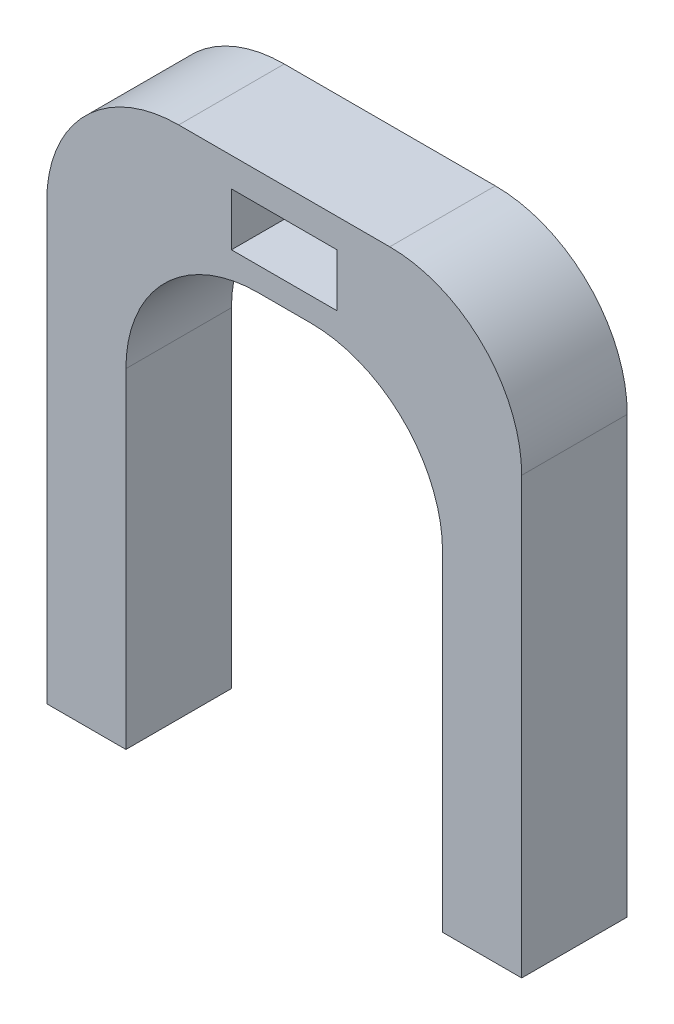
ISO-10303-21;
HEADER;
FILE_DESCRIPTION(('STEP AP214'),'2;1');
FILE_NAME('part.step','',(''),(''),'','','');
FILE_SCHEMA(('AUTOMOTIVE_DESIGN { 1 0 10303 214 1 1 1 1 }'));
ENDSEC;
DATA;
#1=APPLICATION_CONTEXT('core data for automotive mechanical design processes');
#2=APPLICATION_PROTOCOL_DEFINITION('international standard','automotive_design',2000,#1);
#3=PRODUCT_CONTEXT('',#1,'mechanical');
#4=PRODUCT('Part','Part','',(#3));
#5=PRODUCT_RELATED_PRODUCT_CATEGORY('part','',(#4));
#6=PRODUCT_DEFINITION_FORMATION('','',#4);
#7=PRODUCT_DEFINITION_CONTEXT('part definition',#1,'design');
#8=PRODUCT_DEFINITION('design','',#6,#7);
#9=PRODUCT_DEFINITION_SHAPE('','',#8);
#10=(LENGTH_UNIT() NAMED_UNIT(*) SI_UNIT(.MILLI.,.METRE.));
#11=(NAMED_UNIT(*) PLANE_ANGLE_UNIT() SI_UNIT($,.RADIAN.));
#12=(NAMED_UNIT(*) SI_UNIT($,.STERADIAN.) SOLID_ANGLE_UNIT());
#13=UNCERTAINTY_MEASURE_WITH_UNIT(LENGTH_MEASURE(1.E-05),#10,'distance_accuracy_value','');
#14=(GEOMETRIC_REPRESENTATION_CONTEXT(3) GLOBAL_UNCERTAINTY_ASSIGNED_CONTEXT((#13)) GLOBAL_UNIT_ASSIGNED_CONTEXT((#10,
#11,#12)) REPRESENTATION_CONTEXT('',''));
#15=CARTESIAN_POINT('',(0.,0.,0.));
#16=DIRECTION('',(0.,0.,1.));
#17=DIRECTION('',(1.,0.,0.));
#18=AXIS2_PLACEMENT_3D('',#15,#16,#17);
#19=CARTESIAN_POINT('',(0.,0.,4.));
#20=DIRECTION('',(0.,1.,0.));
#21=DIRECTION('',(0.,0.,1.));
#22=AXIS2_PLACEMENT_3D('',#19,#20,#21);
#23=PLANE('',#22);
#24=DIRECTION('',(1.,0.,0.));
#25=VECTOR('',#24,1.);
#26=CARTESIAN_POINT('',(0.,0.,0.));
#27=LINE('',#26,#25);
#28=CARTESIAN_POINT('',(0.,0.,0.));
#29=VERTEX_POINT('',#28);
#30=CARTESIAN_POINT('',(3.,0.,0.));
#31=VERTEX_POINT('',#30);
#32=EDGE_CURVE('E220',#29,#31,#27,.T.);
#33=ORIENTED_EDGE('',*,*,#32,.T.);
#34=DIRECTION('',(0.,0.,1.));
#35=VECTOR('',#34,1.);
#36=CARTESIAN_POINT('',(3.,0.,0.));
#37=LINE('',#36,#35);
#38=CARTESIAN_POINT('',(3.,0.,4.));
#39=VERTEX_POINT('',#38);
#40=EDGE_CURVE('E192',#31,#39,#37,.T.);
#41=ORIENTED_EDGE('',*,*,#40,.T.);
#42=DIRECTION('',(1.,0.,0.));
#43=VECTOR('',#42,1.);
#44=CARTESIAN_POINT('',(0.,0.,4.));
#45=LINE('',#44,#43);
#46=CARTESIAN_POINT('',(0.,0.,4.));
#47=VERTEX_POINT('',#46);
#48=EDGE_CURVE('E208',#47,#39,#45,.T.);
#49=ORIENTED_EDGE('',*,*,#48,.F.);
#50=DIRECTION('',(0.,0.,-1.));
#51=VECTOR('',#50,1.);
#52=CARTESIAN_POINT('',(0.,0.,4.));
#53=LINE('',#52,#51);
#54=EDGE_CURVE('E230',#47,#29,#53,.T.);
#55=ORIENTED_EDGE('',*,*,#54,.T.);
#56=EDGE_LOOP('',(#33,#41,#49,#55));
#57=FACE_BOUND('',#56,.T.);
#58=ADVANCED_FACE('F33',(#57),#23,.F.);
#59=CARTESIAN_POINT('',(0.,0.,4.));
#60=DIRECTION('',(1.,0.,0.));
#61=DIRECTION('',(0.,0.,-1.));
#62=AXIS2_PLACEMENT_3D('',#59,#60,#61);
#63=PLANE('',#62);
#64=DIRECTION('',(0.,-1.,0.));
#65=VECTOR('',#64,1.);
#66=CARTESIAN_POINT('',(0.,0.,4.));
#67=LINE('',#66,#65);
#68=CARTESIAN_POINT('',(0.,16.5,4.));
#69=VERTEX_POINT('',#68);
#70=EDGE_CURVE('E204',#69,#47,#67,.T.);
#71=ORIENTED_EDGE('',*,*,#70,.F.);
#72=DIRECTION('',(0.,0.,-1.));
#73=VECTOR('',#72,1.);
#74=CARTESIAN_POINT('',(0.,16.5,4.));
#75=LINE('',#74,#73);
#76=CARTESIAN_POINT('',(0.,16.5,0.));
#77=VERTEX_POINT('',#76);
#78=EDGE_CURVE('E11',#69,#77,#75,.T.);
#79=ORIENTED_EDGE('',*,*,#78,.T.);
#80=DIRECTION('',(0.,-1.,0.));
#81=VECTOR('',#80,1.);
#82=CARTESIAN_POINT('',(0.,0.,0.));
#83=LINE('',#82,#81);
#84=EDGE_CURVE('E201',#77,#29,#83,.T.);
#85=ORIENTED_EDGE('',*,*,#84,.T.);
#86=ORIENTED_EDGE('',*,*,#54,.F.);
#87=EDGE_LOOP('',(#71,#79,#85,#86));
#88=FACE_BOUND('',#87,.T.);
#89=ADVANCED_FACE('F314',(#88),#63,.F.);
#90=CARTESIAN_POINT('',(15.,0.,4.));
#91=VERTEX_POINT('',#90);
#92=CARTESIAN_POINT('',(18.,0.,4.));
#93=VERTEX_POINT('',#92);
#94=EDGE_CURVE('E206',#91,#93,#45,.T.);
#95=ORIENTED_EDGE('',*,*,#94,.F.);
#96=DIRECTION('',(0.,0.,1.));
#97=VECTOR('',#96,1.);
#98=CARTESIAN_POINT('',(15.,0.,0.));
#99=LINE('',#98,#97);
#100=CARTESIAN_POINT('',(15.,0.,0.));
#101=VERTEX_POINT('',#100);
#102=EDGE_CURVE('E199',#101,#91,#99,.T.);
#103=ORIENTED_EDGE('',*,*,#102,.F.);
#104=CARTESIAN_POINT('',(18.,0.,0.));
#105=VERTEX_POINT('',#104);
#106=EDGE_CURVE('E219',#101,#105,#27,.T.);
#107=ORIENTED_EDGE('',*,*,#106,.T.);
#108=DIRECTION('',(0.,0.,-1.));
#109=VECTOR('',#108,1.);
#110=CARTESIAN_POINT('',(18.,0.,4.));
#111=LINE('',#110,#109);
#112=EDGE_CURVE('E217',#93,#105,#111,.T.);
#113=ORIENTED_EDGE('',*,*,#112,.F.);
#114=EDGE_LOOP('',(#95,#103,#107,#113));
#115=FACE_BOUND('',#114,.T.);
#116=ADVANCED_FACE('F284',(#115),#23,.F.);
#117=CARTESIAN_POINT('',(18.,0.,4.));
#118=DIRECTION('',(-1.,0.,0.));
#119=DIRECTION('',(0.,0.,1.));
#120=AXIS2_PLACEMENT_3D('',#117,#118,#119);
#121=PLANE('',#120);
#122=DIRECTION('',(0.,1.,0.));
#123=VECTOR('',#122,1.);
#124=CARTESIAN_POINT('',(18.,0.,0.));
#125=LINE('',#124,#123);
#126=CARTESIAN_POINT('',(18.,16.5,0.));
#127=VERTEX_POINT('',#126);
#128=EDGE_CURVE('E223',#105,#127,#125,.T.);
#129=ORIENTED_EDGE('',*,*,#128,.T.);
#130=DIRECTION('',(0.,0.,-1.));
#131=VECTOR('',#130,1.);
#132=CARTESIAN_POINT('',(18.,16.5,4.));
#133=LINE('',#132,#131);
#134=CARTESIAN_POINT('',(18.,16.5,4.));
#135=VERTEX_POINT('',#134);
#136=EDGE_CURVE('E260',#127,#135,#133,.F.);
#137=ORIENTED_EDGE('',*,*,#136,.T.);
#138=DIRECTION('',(0.,1.,0.));
#139=VECTOR('',#138,1.);
#140=CARTESIAN_POINT('',(18.,0.,4.));
#141=LINE('',#140,#139);
#142=EDGE_CURVE('E211',#93,#135,#141,.T.);
#143=ORIENTED_EDGE('',*,*,#142,.F.);
#144=ORIENTED_EDGE('',*,*,#112,.T.);
#145=EDGE_LOOP('',(#129,#137,#143,#144));
#146=FACE_BOUND('',#145,.T.);
#147=ADVANCED_FACE('F280',(#146),#121,.F.);
#148=CARTESIAN_POINT('',(0.,21.5,4.));
#149=DIRECTION('',(0.,-1.,0.));
#150=DIRECTION('',(0.,0.,-1.));
#151=AXIS2_PLACEMENT_3D('',#148,#149,#150);
#152=PLANE('',#151);
#153=DIRECTION('',(-1.,0.,0.));
#154=VECTOR('',#153,1.);
#155=CARTESIAN_POINT('',(0.,21.5,4.));
#156=LINE('',#155,#154);
#157=CARTESIAN_POINT('',(13.,21.5,4.));
#158=VERTEX_POINT('',#157);
#159=CARTESIAN_POINT('',(5.,21.5,4.));
#160=VERTEX_POINT('',#159);
#161=EDGE_CURVE('E214',#158,#160,#156,.T.);
#162=ORIENTED_EDGE('',*,*,#161,.F.);
#163=DIRECTION('',(0.,0.,-1.));
#164=VECTOR('',#163,1.);
#165=CARTESIAN_POINT('',(13.,21.5,4.));
#166=LINE('',#165,#164);
#167=CARTESIAN_POINT('',(13.,21.5,0.));
#168=VERTEX_POINT('',#167);
#169=EDGE_CURVE('E253',#158,#168,#166,.T.);
#170=ORIENTED_EDGE('',*,*,#169,.T.);
#171=DIRECTION('',(-1.,0.,0.));
#172=VECTOR('',#171,1.);
#173=CARTESIAN_POINT('',(0.,21.5,0.));
#174=LINE('',#173,#172);
#175=CARTESIAN_POINT('',(5.,21.5,0.));
#176=VERTEX_POINT('',#175);
#177=EDGE_CURVE('E207',#168,#176,#174,.T.);
#178=ORIENTED_EDGE('',*,*,#177,.T.);
#179=DIRECTION('',(0.,0.,-1.));
#180=VECTOR('',#179,1.);
#181=CARTESIAN_POINT('',(5.,21.5,4.));
#182=LINE('',#181,#180);
#183=EDGE_CURVE('E251',#176,#160,#182,.F.);
#184=ORIENTED_EDGE('',*,*,#183,.T.);
#185=EDGE_LOOP('',(#162,#170,#178,#184));
#186=FACE_BOUND('',#185,.T.);
#187=ADVANCED_FACE('F273',(#186),#152,.F.);
#188=CARTESIAN_POINT('',(0.,0.,4.));
#189=DIRECTION('',(0.,0.,-1.));
#190=DIRECTION('',(-1.,0.,0.));
#191=AXIS2_PLACEMENT_3D('',#188,#189,#190);
#192=PLANE('',#191);
#193=DIRECTION('',(1.,0.,0.));
#194=VECTOR('',#193,1.);
#195=CARTESIAN_POINT('',(7.,18.4009479824988,4.));
#196=LINE('',#195,#194);
#197=CARTESIAN_POINT('',(7.,18.4009479824988,4.));
#198=VERTEX_POINT('',#197);
#199=CARTESIAN_POINT('',(11.,18.4009479824988,4.));
#200=VERTEX_POINT('',#199);
#201=EDGE_CURVE('E173',#198,#200,#196,.T.);
#202=ORIENTED_EDGE('',*,*,#201,.F.);
#203=DIRECTION('',(0.,-1.,0.));
#204=VECTOR('',#203,1.);
#205=CARTESIAN_POINT('',(7.,20.4009479824988,4.));
#206=LINE('',#205,#204);
#207=CARTESIAN_POINT('',(7.,20.4009479824988,4.));
#208=VERTEX_POINT('',#207);
#209=EDGE_CURVE('E48',#208,#198,#206,.T.);
#210=ORIENTED_EDGE('',*,*,#209,.F.);
#211=DIRECTION('',(-1.,0.,0.));
#212=VECTOR('',#211,1.);
#213=CARTESIAN_POINT('',(7.,20.4009479824988,4.));
#214=LINE('',#213,#212);
#215=CARTESIAN_POINT('',(11.,20.4009479824988,4.));
#216=VERTEX_POINT('',#215);
#217=EDGE_CURVE('E164',#216,#208,#214,.T.);
#218=ORIENTED_EDGE('',*,*,#217,.F.);
#219=DIRECTION('',(0.,1.,0.));
#220=VECTOR('',#219,1.);
#221=CARTESIAN_POINT('',(11.,20.4009479824988,4.));
#222=LINE('',#221,#220);
#223=EDGE_CURVE('E167',#200,#216,#222,.T.);
#224=ORIENTED_EDGE('',*,*,#223,.F.);
#225=EDGE_LOOP('',(#202,#210,#218,#224));
#226=FACE_BOUND('',#225,.T.);
#227=ORIENTED_EDGE('',*,*,#142,.T.);
#228=CARTESIAN_POINT('',(13.,16.5,4.));
#229=DIRECTION('',(0.,0.,-1.));
#230=DIRECTION('',(-1.,0.,0.));
#231=AXIS2_PLACEMENT_3D('',#228,#229,#230);
#232=CIRCLE('',#231,5.);
#233=EDGE_CURVE('E41',#135,#158,#232,.F.);
#234=ORIENTED_EDGE('',*,*,#233,.T.);
#235=ORIENTED_EDGE('',*,*,#161,.T.);
#236=CARTESIAN_POINT('',(5.,16.5,4.));
#237=DIRECTION('',(0.,0.,-1.));
#238=DIRECTION('',(-1.,0.,0.));
#239=AXIS2_PLACEMENT_3D('',#236,#237,#238);
#240=CIRCLE('',#239,5.);
#241=EDGE_CURVE('E262',#160,#69,#240,.F.);
#242=ORIENTED_EDGE('',*,*,#241,.T.);
#243=ORIENTED_EDGE('',*,*,#70,.T.);
#244=ORIENTED_EDGE('',*,*,#48,.T.);
#245=DIRECTION('',(0.,-1.,0.));
#246=VECTOR('',#245,1.);
#247=CARTESIAN_POINT('',(3.,0.,4.));
#248=LINE('',#247,#246);
#249=CARTESIAN_POINT('',(3.,12.5,4.));
#250=VERTEX_POINT('',#249);
#251=EDGE_CURVE('E179',#250,#39,#248,.T.);
#252=ORIENTED_EDGE('',*,*,#251,.F.);
#253=CARTESIAN_POINT('',(8.,12.5,4.));
#254=DIRECTION('',(0.,0.,-1.));
#255=DIRECTION('',(-1.,0.,0.));
#256=AXIS2_PLACEMENT_3D('',#253,#254,#255);
#257=CIRCLE('',#256,5.);
#258=CARTESIAN_POINT('',(8.,17.5,4.));
#259=VERTEX_POINT('',#258);
#260=EDGE_CURVE('E247',#250,#259,#257,.T.);
#261=ORIENTED_EDGE('',*,*,#260,.T.);
#262=DIRECTION('',(-1.,0.,0.));
#263=VECTOR('',#262,1.);
#264=CARTESIAN_POINT('',(3.,17.5,4.));
#265=LINE('',#264,#263);
#266=CARTESIAN_POINT('',(10.,17.5,4.));
#267=VERTEX_POINT('',#266);
#268=EDGE_CURVE('E186',#267,#259,#265,.T.);
#269=ORIENTED_EDGE('',*,*,#268,.F.);
#270=CARTESIAN_POINT('',(10.,12.5,4.));
#271=DIRECTION('',(0.,0.,-1.));
#272=DIRECTION('',(-1.,0.,0.));
#273=AXIS2_PLACEMENT_3D('',#270,#271,#272);
#274=CIRCLE('',#273,5.);
#275=CARTESIAN_POINT('',(15.,12.5,4.));
#276=VERTEX_POINT('',#275);
#277=EDGE_CURVE('E243',#267,#276,#274,.T.);
#278=ORIENTED_EDGE('',*,*,#277,.T.);
#279=DIRECTION('',(0.,1.,0.));
#280=VECTOR('',#279,1.);
#281=CARTESIAN_POINT('',(15.,0.,4.));
#282=LINE('',#281,#280);
#283=EDGE_CURVE('E194',#91,#276,#282,.T.);
#284=ORIENTED_EDGE('',*,*,#283,.F.);
#285=ORIENTED_EDGE('',*,*,#94,.T.);
#286=EDGE_LOOP('',(#227,#234,#235,#242,#243,#244,#252,#261,#269,#278,#284,#285));
#287=FACE_BOUND('',#286,.T.);
#288=ADVANCED_FACE('F266',(#226,#287),#192,.F.);
#289=CARTESIAN_POINT('',(0.,0.,0.));
#290=DIRECTION('',(0.,0.,-1.));
#291=DIRECTION('',(-1.,0.,0.));
#292=AXIS2_PLACEMENT_3D('',#289,#290,#291);
#293=PLANE('',#292);
#294=DIRECTION('',(0.,-1.,0.));
#295=VECTOR('',#294,1.);
#296=CARTESIAN_POINT('',(7.,20.4009479824988,0.));
#297=LINE('',#296,#295);
#298=CARTESIAN_POINT('',(7.,20.4009479824988,0.));
#299=VERTEX_POINT('',#298);
#300=CARTESIAN_POINT('',(7.,18.4009479824988,0.));
#301=VERTEX_POINT('',#300);
#302=EDGE_CURVE('E148',#299,#301,#297,.T.);
#303=ORIENTED_EDGE('',*,*,#302,.T.);
#304=DIRECTION('',(1.,0.,0.));
#305=VECTOR('',#304,1.);
#306=CARTESIAN_POINT('',(7.,18.4009479824988,0.));
#307=LINE('',#306,#305);
#308=CARTESIAN_POINT('',(11.,18.4009479824988,0.));
#309=VERTEX_POINT('',#308);
#310=EDGE_CURVE('E157',#301,#309,#307,.T.);
#311=ORIENTED_EDGE('',*,*,#310,.T.);
#312=DIRECTION('',(0.,1.,0.));
#313=VECTOR('',#312,1.);
#314=CARTESIAN_POINT('',(11.,20.4009479824988,0.));
#315=LINE('',#314,#313);
#316=CARTESIAN_POINT('',(11.,20.4009479824988,0.));
#317=VERTEX_POINT('',#316);
#318=EDGE_CURVE('E56',#309,#317,#315,.T.);
#319=ORIENTED_EDGE('',*,*,#318,.T.);
#320=DIRECTION('',(-1.,0.,0.));
#321=VECTOR('',#320,1.);
#322=CARTESIAN_POINT('',(7.,20.4009479824988,0.));
#323=LINE('',#322,#321);
#324=EDGE_CURVE('E154',#317,#299,#323,.T.);
#325=ORIENTED_EDGE('',*,*,#324,.T.);
#326=EDGE_LOOP('',(#303,#311,#319,#325));
#327=FACE_BOUND('',#326,.T.);
#328=ORIENTED_EDGE('',*,*,#177,.F.);
#329=CARTESIAN_POINT('',(13.,16.5,0.));
#330=DIRECTION('',(0.,0.,-1.));
#331=DIRECTION('',(-1.,0.,0.));
#332=AXIS2_PLACEMENT_3D('',#329,#330,#331);
#333=CIRCLE('',#332,5.);
#334=EDGE_CURVE('E258',#168,#127,#333,.T.);
#335=ORIENTED_EDGE('',*,*,#334,.T.);
#336=ORIENTED_EDGE('',*,*,#128,.F.);
#337=ORIENTED_EDGE('',*,*,#106,.F.);
#338=DIRECTION('',(0.,1.,0.));
#339=VECTOR('',#338,1.);
#340=CARTESIAN_POINT('',(15.,0.,0.));
#341=LINE('',#340,#339);
#342=CARTESIAN_POINT('',(15.,12.5,0.));
#343=VERTEX_POINT('',#342);
#344=EDGE_CURVE('E185',#101,#343,#341,.T.);
#345=ORIENTED_EDGE('',*,*,#344,.T.);
#346=CARTESIAN_POINT('',(10.,12.5,0.));
#347=DIRECTION('',(0.,0.,-1.));
#348=DIRECTION('',(-1.,0.,0.));
#349=AXIS2_PLACEMENT_3D('',#346,#347,#348);
#350=CIRCLE('',#349,5.);
#351=CARTESIAN_POINT('',(10.,17.5,0.));
#352=VERTEX_POINT('',#351);
#353=EDGE_CURVE('E245',#343,#352,#350,.F.);
#354=ORIENTED_EDGE('',*,*,#353,.T.);
#355=DIRECTION('',(-1.,0.,0.));
#356=VECTOR('',#355,1.);
#357=CARTESIAN_POINT('',(3.,17.5,0.));
#358=LINE('',#357,#356);
#359=CARTESIAN_POINT('',(8.,17.5,0.));
#360=VERTEX_POINT('',#359);
#361=EDGE_CURVE('E189',#352,#360,#358,.T.);
#362=ORIENTED_EDGE('',*,*,#361,.T.);
#363=CARTESIAN_POINT('',(8.,12.5,0.));
#364=DIRECTION('',(0.,0.,-1.));
#365=DIRECTION('',(-1.,0.,0.));
#366=AXIS2_PLACEMENT_3D('',#363,#364,#365);
#367=CIRCLE('',#366,5.);
#368=CARTESIAN_POINT('',(3.,12.5,0.));
#369=VERTEX_POINT('',#368);
#370=EDGE_CURVE('E249',#360,#369,#367,.F.);
#371=ORIENTED_EDGE('',*,*,#370,.T.);
#372=DIRECTION('',(0.,-1.,0.));
#373=VECTOR('',#372,1.);
#374=CARTESIAN_POINT('',(3.,0.,0.));
#375=LINE('',#374,#373);
#376=EDGE_CURVE('E183',#369,#31,#375,.T.);
#377=ORIENTED_EDGE('',*,*,#376,.T.);
#378=ORIENTED_EDGE('',*,*,#32,.F.);
#379=ORIENTED_EDGE('',*,*,#84,.F.);
#380=CARTESIAN_POINT('',(5.,16.5,0.));
#381=DIRECTION('',(0.,0.,-1.));
#382=DIRECTION('',(-1.,0.,0.));
#383=AXIS2_PLACEMENT_3D('',#380,#381,#382);
#384=CIRCLE('',#383,5.);
#385=EDGE_CURVE('E256',#77,#176,#384,.T.);
#386=ORIENTED_EDGE('',*,*,#385,.T.);
#387=EDGE_LOOP('',(#328,#335,#336,#337,#345,#354,#362,#371,#377,#378,#379,#386));
#388=FACE_BOUND('',#387,.T.);
#389=ADVANCED_FACE('F161',(#327,#388),#293,.T.);
#390=CARTESIAN_POINT('',(3.,0.,0.));
#391=DIRECTION('',(-1.,0.,0.));
#392=DIRECTION('',(0.,0.,1.));
#393=AXIS2_PLACEMENT_3D('',#390,#391,#392);
#394=PLANE('',#393);
#395=ORIENTED_EDGE('',*,*,#376,.F.);
#396=DIRECTION('',(0.,0.,1.));
#397=VECTOR('',#396,1.);
#398=CARTESIAN_POINT('',(3.,12.5,4.));
#399=LINE('',#398,#397);
#400=EDGE_CURVE('E240',#369,#250,#399,.T.);
#401=ORIENTED_EDGE('',*,*,#400,.T.);
#402=ORIENTED_EDGE('',*,*,#251,.T.);
#403=ORIENTED_EDGE('',*,*,#40,.F.);
#404=EDGE_LOOP('',(#395,#401,#402,#403));
#405=FACE_BOUND('',#404,.T.);
#406=ADVANCED_FACE('F305',(#405),#394,.F.);
#407=CARTESIAN_POINT('',(3.,17.5,0.));
#408=DIRECTION('',(0.,1.,0.));
#409=DIRECTION('',(0.,0.,1.));
#410=AXIS2_PLACEMENT_3D('',#407,#408,#409);
#411=PLANE('',#410);
#412=ORIENTED_EDGE('',*,*,#361,.F.);
#413=DIRECTION('',(0.,0.,1.));
#414=VECTOR('',#413,1.);
#415=CARTESIAN_POINT('',(10.,17.5,4.));
#416=LINE('',#415,#414);
#417=EDGE_CURVE('E235',#352,#267,#416,.T.);
#418=ORIENTED_EDGE('',*,*,#417,.T.);
#419=ORIENTED_EDGE('',*,*,#268,.T.);
#420=DIRECTION('',(0.,0.,1.));
#421=VECTOR('',#420,1.);
#422=CARTESIAN_POINT('',(8.,17.5,0.));
#423=LINE('',#422,#421);
#424=EDGE_CURVE('E233',#259,#360,#423,.F.);
#425=ORIENTED_EDGE('',*,*,#424,.T.);
#426=EDGE_LOOP('',(#412,#418,#419,#425));
#427=FACE_BOUND('',#426,.T.);
#428=ADVANCED_FACE('F295',(#427),#411,.F.);
#429=CARTESIAN_POINT('',(15.,0.,0.));
#430=DIRECTION('',(1.,0.,0.));
#431=DIRECTION('',(0.,0.,-1.));
#432=AXIS2_PLACEMENT_3D('',#429,#430,#431);
#433=PLANE('',#432);
#434=ORIENTED_EDGE('',*,*,#283,.T.);
#435=DIRECTION('',(0.,0.,1.));
#436=VECTOR('',#435,1.);
#437=CARTESIAN_POINT('',(15.,12.5,0.));
#438=LINE('',#437,#436);
#439=EDGE_CURVE('E238',#276,#343,#438,.F.);
#440=ORIENTED_EDGE('',*,*,#439,.T.);
#441=ORIENTED_EDGE('',*,*,#344,.F.);
#442=ORIENTED_EDGE('',*,*,#102,.T.);
#443=EDGE_LOOP('',(#434,#440,#441,#442));
#444=FACE_BOUND('',#443,.T.);
#445=ADVANCED_FACE('F347',(#444),#433,.F.);
#446=CARTESIAN_POINT('',(10.,12.5,0.));
#447=DIRECTION('',(0.,0.,-1.));
#448=DIRECTION('',(-1.,0.,0.));
#449=AXIS2_PLACEMENT_3D('',#446,#447,#448);
#450=CYLINDRICAL_SURFACE('',#449,5.);
#451=ORIENTED_EDGE('',*,*,#353,.F.);
#452=ORIENTED_EDGE('',*,*,#439,.F.);
#453=ORIENTED_EDGE('',*,*,#277,.F.);
#454=ORIENTED_EDGE('',*,*,#417,.F.);
#455=EDGE_LOOP('',(#451,#452,#453,#454));
#456=FACE_BOUND('',#455,.T.);
#457=ADVANCED_FACE('F292',(#456),#450,.F.);
#458=CARTESIAN_POINT('',(8.,12.5,0.));
#459=DIRECTION('',(0.,0.,-1.));
#460=DIRECTION('',(-1.,0.,0.));
#461=AXIS2_PLACEMENT_3D('',#458,#459,#460);
#462=CYLINDRICAL_SURFACE('',#461,5.);
#463=ORIENTED_EDGE('',*,*,#370,.F.);
#464=ORIENTED_EDGE('',*,*,#424,.F.);
#465=ORIENTED_EDGE('',*,*,#260,.F.);
#466=ORIENTED_EDGE('',*,*,#400,.F.);
#467=EDGE_LOOP('',(#463,#464,#465,#466));
#468=FACE_BOUND('',#467,.T.);
#469=ADVANCED_FACE('F302',(#468),#462,.F.);
#470=CARTESIAN_POINT('',(13.,16.5,4.));
#471=DIRECTION('',(0.,0.,-1.));
#472=DIRECTION('',(-1.,0.,0.));
#473=AXIS2_PLACEMENT_3D('',#470,#471,#472);
#474=CYLINDRICAL_SURFACE('',#473,5.);
#475=ORIENTED_EDGE('',*,*,#233,.F.);
#476=ORIENTED_EDGE('',*,*,#136,.F.);
#477=ORIENTED_EDGE('',*,*,#334,.F.);
#478=ORIENTED_EDGE('',*,*,#169,.F.);
#479=EDGE_LOOP('',(#475,#476,#477,#478));
#480=FACE_BOUND('',#479,.T.);
#481=ADVANCED_FACE('F276',(#480),#474,.T.);
#482=CARTESIAN_POINT('',(5.,16.5,4.));
#483=DIRECTION('',(0.,0.,-1.));
#484=DIRECTION('',(-1.,0.,0.));
#485=AXIS2_PLACEMENT_3D('',#482,#483,#484);
#486=CYLINDRICAL_SURFACE('',#485,5.);
#487=ORIENTED_EDGE('',*,*,#241,.F.);
#488=ORIENTED_EDGE('',*,*,#183,.F.);
#489=ORIENTED_EDGE('',*,*,#385,.F.);
#490=ORIENTED_EDGE('',*,*,#78,.F.);
#491=EDGE_LOOP('',(#487,#488,#489,#490));
#492=FACE_BOUND('',#491,.T.);
#493=ADVANCED_FACE('F35',(#492),#486,.T.);
#494=CARTESIAN_POINT('',(7.,20.4009479824988,0.));
#495=DIRECTION('',(-1.,0.,0.));
#496=DIRECTION('',(0.,0.,1.));
#497=AXIS2_PLACEMENT_3D('',#494,#495,#496);
#498=PLANE('',#497);
#499=ORIENTED_EDGE('',*,*,#209,.T.);
#500=DIRECTION('',(0.,0.,1.));
#501=VECTOR('',#500,1.);
#502=CARTESIAN_POINT('',(7.,18.4009479824988,0.));
#503=LINE('',#502,#501);
#504=EDGE_CURVE('E144',#301,#198,#503,.T.);
#505=ORIENTED_EDGE('',*,*,#504,.F.);
#506=ORIENTED_EDGE('',*,*,#302,.F.);
#507=DIRECTION('',(0.,0.,1.));
#508=VECTOR('',#507,1.);
#509=CARTESIAN_POINT('',(7.,20.4009479824988,0.));
#510=LINE('',#509,#508);
#511=EDGE_CURVE('E177',#299,#208,#510,.T.);
#512=ORIENTED_EDGE('',*,*,#511,.T.);
#513=EDGE_LOOP('',(#499,#505,#506,#512));
#514=FACE_BOUND('',#513,.T.);
#515=ADVANCED_FACE('F146',(#514),#498,.F.);
#516=CARTESIAN_POINT('',(7.,20.4009479824988,0.));
#517=DIRECTION('',(0.,1.,0.));
#518=DIRECTION('',(0.,0.,1.));
#519=AXIS2_PLACEMENT_3D('',#516,#517,#518);
#520=PLANE('',#519);
#521=ORIENTED_EDGE('',*,*,#217,.T.);
#522=ORIENTED_EDGE('',*,*,#511,.F.);
#523=ORIENTED_EDGE('',*,*,#324,.F.);
#524=DIRECTION('',(0.,0.,1.));
#525=VECTOR('',#524,1.);
#526=CARTESIAN_POINT('',(11.,20.4009479824988,0.));
#527=LINE('',#526,#525);
#528=EDGE_CURVE('E180',#317,#216,#527,.T.);
#529=ORIENTED_EDGE('',*,*,#528,.T.);
#530=EDGE_LOOP('',(#521,#522,#523,#529));
#531=FACE_BOUND('',#530,.T.);
#532=ADVANCED_FACE('F322',(#531),#520,.F.);
#533=CARTESIAN_POINT('',(11.,20.4009479824988,0.));
#534=DIRECTION('',(1.,0.,0.));
#535=DIRECTION('',(0.,0.,-1.));
#536=AXIS2_PLACEMENT_3D('',#533,#534,#535);
#537=PLANE('',#536);
#538=ORIENTED_EDGE('',*,*,#223,.T.);
#539=ORIENTED_EDGE('',*,*,#528,.F.);
#540=ORIENTED_EDGE('',*,*,#318,.F.);
#541=DIRECTION('',(0.,0.,1.));
#542=VECTOR('',#541,1.);
#543=CARTESIAN_POINT('',(11.,18.4009479824988,0.));
#544=LINE('',#543,#542);
#545=EDGE_CURVE('E153',#309,#200,#544,.T.);
#546=ORIENTED_EDGE('',*,*,#545,.T.);
#547=EDGE_LOOP('',(#538,#539,#540,#546));
#548=FACE_BOUND('',#547,.T.);
#549=ADVANCED_FACE('F354',(#548),#537,.F.);
#550=CARTESIAN_POINT('',(7.,18.4009479824988,0.));
#551=DIRECTION('',(0.,-1.,0.));
#552=DIRECTION('',(0.,0.,-1.));
#553=AXIS2_PLACEMENT_3D('',#550,#551,#552);
#554=PLANE('',#553);
#555=ORIENTED_EDGE('',*,*,#201,.T.);
#556=ORIENTED_EDGE('',*,*,#545,.F.);
#557=ORIENTED_EDGE('',*,*,#310,.F.);
#558=ORIENTED_EDGE('',*,*,#504,.T.);
#559=EDGE_LOOP('',(#555,#556,#557,#558));
#560=FACE_BOUND('',#559,.T.);
#561=ADVANCED_FACE('F158',(#560),#554,.F.);
#562=CLOSED_SHELL('',(#58,#89,#116,#147,#187,#288,#389,#406,#428,#445,#457,#469,#481,#493,#515,
#532,#549,#561));
#563=MANIFOLD_SOLID_BREP('B2',#562);
#564=ADVANCED_BREP_SHAPE_REPRESENTATION('',(#18,#563),#14);
#565=SHAPE_DEFINITION_REPRESENTATION(#9,#564);
ENDSEC;
END-ISO-10303-21;
